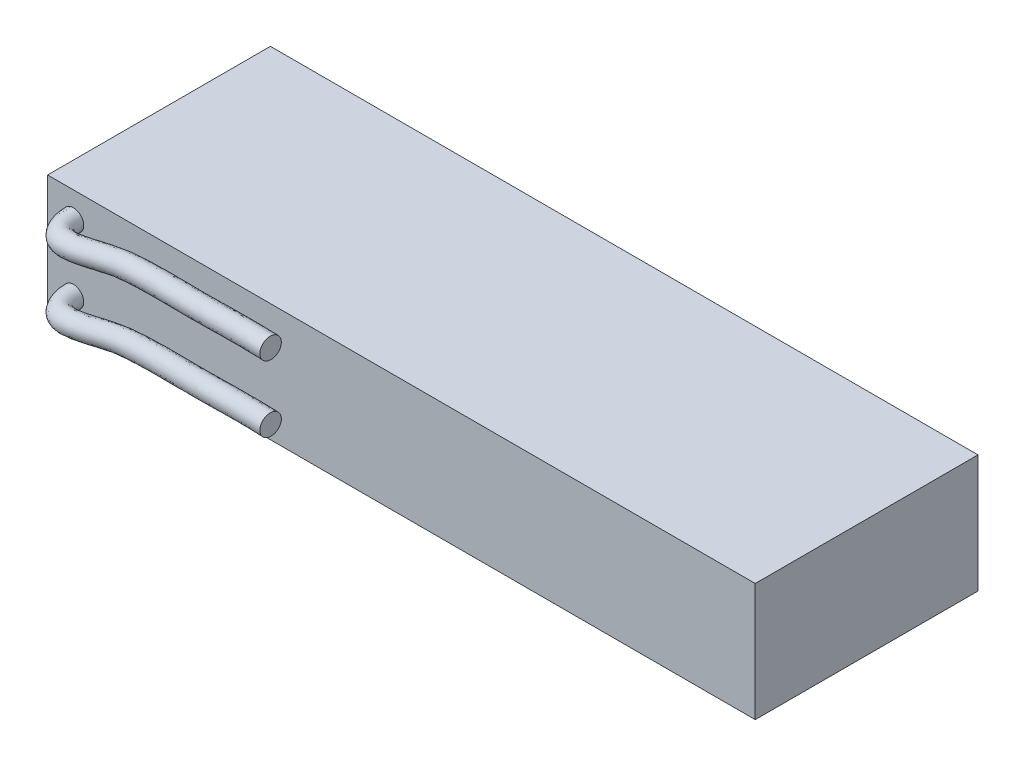
ISO-10303-21;
HEADER;
FILE_DESCRIPTION(('STEP AP214'),'2;1');
FILE_NAME('part.step','',(''),(''),'','','');
FILE_SCHEMA(('AUTOMOTIVE_DESIGN { 1 0 10303 214 1 1 1 1 }'));
ENDSEC;
DATA;
#1=APPLICATION_CONTEXT('core data for automotive mechanical design processes');
#2=APPLICATION_PROTOCOL_DEFINITION('international standard','automotive_design',2000,#1);
#3=PRODUCT_CONTEXT('',#1,'mechanical');
#4=PRODUCT('Part','Part','',(#3));
#5=PRODUCT_RELATED_PRODUCT_CATEGORY('part','',(#4));
#6=PRODUCT_DEFINITION_FORMATION('','',#4);
#7=PRODUCT_DEFINITION_CONTEXT('part definition',#1,'design');
#8=PRODUCT_DEFINITION('design','',#6,#7);
#9=PRODUCT_DEFINITION_SHAPE('','',#8);
#10=(LENGTH_UNIT() NAMED_UNIT(*) SI_UNIT(.MILLI.,.METRE.));
#11=(NAMED_UNIT(*) PLANE_ANGLE_UNIT() SI_UNIT($,.RADIAN.));
#12=(NAMED_UNIT(*) SI_UNIT($,.STERADIAN.) SOLID_ANGLE_UNIT());
#13=UNCERTAINTY_MEASURE_WITH_UNIT(LENGTH_MEASURE(1.E-05),#10,'distance_accuracy_value','');
#14=(GEOMETRIC_REPRESENTATION_CONTEXT(3) GLOBAL_UNCERTAINTY_ASSIGNED_CONTEXT((#13)) GLOBAL_UNIT_ASSIGNED_CONTEXT((#10,
#11,#12)) REPRESENTATION_CONTEXT('',''));
#15=CARTESIAN_POINT('',(0.,0.,0.));
#16=DIRECTION('',(0.,0.,1.));
#17=DIRECTION('',(1.,0.,0.));
#18=AXIS2_PLACEMENT_3D('',#15,#16,#17);
#19=CARTESIAN_POINT('',(0.,22.86,0.));
#20=DIRECTION('',(1.,0.,0.));
#21=DIRECTION('',(0.,0.,-1.));
#22=AXIS2_PLACEMENT_3D('',#19,#20,#21);
#23=PLANE('',#22);
#24=DIRECTION('',(0.,0.,1.));
#25=VECTOR('',#24,1.);
#26=CARTESIAN_POINT('',(0.,0.,0.));
#27=LINE('',#26,#25);
#28=CARTESIAN_POINT('',(0.,0.,-43.18));
#29=VERTEX_POINT('',#28);
#30=CARTESIAN_POINT('',(0.,0.,0.));
#31=VERTEX_POINT('',#30);
#32=EDGE_CURVE('E102',#29,#31,#27,.T.);
#33=ORIENTED_EDGE('',*,*,#32,.T.);
#34=DIRECTION('',(0.,-1.,0.));
#35=VECTOR('',#34,1.);
#36=CARTESIAN_POINT('',(0.,22.86,0.));
#37=LINE('',#36,#35);
#38=CARTESIAN_POINT('',(0.,22.86,0.));
#39=VERTEX_POINT('',#38);
#40=EDGE_CURVE('E11',#39,#31,#37,.T.);
#41=ORIENTED_EDGE('',*,*,#40,.F.);
#42=DIRECTION('',(0.,0.,1.));
#43=VECTOR('',#42,1.);
#44=CARTESIAN_POINT('',(0.,22.86,0.));
#45=LINE('',#44,#43);
#46=CARTESIAN_POINT('',(0.,22.86,-43.18));
#47=VERTEX_POINT('',#46);
#48=EDGE_CURVE('E103',#47,#39,#45,.T.);
#49=ORIENTED_EDGE('',*,*,#48,.F.);
#50=DIRECTION('',(0.,-1.,0.));
#51=VECTOR('',#50,1.);
#52=CARTESIAN_POINT('',(0.,22.86,-43.18));
#53=LINE('',#52,#51);
#54=EDGE_CURVE('E109',#47,#29,#53,.T.);
#55=ORIENTED_EDGE('',*,*,#54,.T.);
#56=EDGE_LOOP('',(#33,#41,#49,#55));
#57=FACE_BOUND('',#56,.T.);
#58=ADVANCED_FACE('F34',(#57),#23,.F.);
#59=CARTESIAN_POINT('',(0.,22.86,0.));
#60=DIRECTION('',(0.,0.,-1.));
#61=DIRECTION('',(-1.,0.,0.));
#62=AXIS2_PLACEMENT_3D('',#59,#60,#61);
#63=PLANE('',#62);
#64=CARTESIAN_POINT('',(5.,5.,0.));
#65=DIRECTION('',(0.,0.,1.));
#66=DIRECTION('',(1.,0.,0.));
#67=AXIS2_PLACEMENT_3D('',#64,#65,#66);
#68=CIRCLE('',#67,2.);
#69=CARTESIAN_POINT('',(7.,5.,0.));
#70=VERTEX_POINT('',#69);
#71=EDGE_CURVE('E93',#70,#70,#68,.T.);
#72=ORIENTED_EDGE('',*,*,#71,.F.);
#73=EDGE_LOOP('',(#72));
#74=FACE_BOUND('',#73,.T.);
#75=CARTESIAN_POINT('',(5.,17.86,0.));
#76=DIRECTION('',(0.,0.,1.));
#77=DIRECTION('',(-1.,0.,0.));
#78=AXIS2_PLACEMENT_3D('',#75,#76,#77);
#79=CIRCLE('',#78,2.);
#80=CARTESIAN_POINT('',(3.,17.86,0.));
#81=VERTEX_POINT('',#80);
#82=EDGE_CURVE('E92',#81,#81,#79,.T.);
#83=ORIENTED_EDGE('',*,*,#82,.F.);
#84=EDGE_LOOP('',(#83));
#85=FACE_BOUND('',#84,.T.);
#86=DIRECTION('',(1.,0.,0.));
#87=VECTOR('',#86,1.);
#88=CARTESIAN_POINT('',(0.,0.,0.));
#89=LINE('',#88,#87);
#90=CARTESIAN_POINT('',(137.16,0.,0.));
#91=VERTEX_POINT('',#90);
#92=EDGE_CURVE('E112',#31,#91,#89,.T.);
#93=ORIENTED_EDGE('',*,*,#92,.T.);
#94=DIRECTION('',(0.,-1.,0.));
#95=VECTOR('',#94,1.);
#96=CARTESIAN_POINT('',(137.16,22.86,0.));
#97=LINE('',#96,#95);
#98=CARTESIAN_POINT('',(137.16,22.86,0.));
#99=VERTEX_POINT('',#98);
#100=EDGE_CURVE('E42',#99,#91,#97,.T.);
#101=ORIENTED_EDGE('',*,*,#100,.F.);
#102=DIRECTION('',(1.,0.,0.));
#103=VECTOR('',#102,1.);
#104=CARTESIAN_POINT('',(0.,22.86,0.));
#105=LINE('',#104,#103);
#106=EDGE_CURVE('E81',#39,#99,#105,.T.);
#107=ORIENTED_EDGE('',*,*,#106,.F.);
#108=ORIENTED_EDGE('',*,*,#40,.T.);
#109=EDGE_LOOP('',(#93,#101,#107,#108));
#110=FACE_BOUND('',#109,.T.);
#111=ADVANCED_FACE('F135',(#74,#85,#110),#63,.F.);
#112=CARTESIAN_POINT('',(137.16,22.86,0.));
#113=DIRECTION('',(-1.,0.,0.));
#114=DIRECTION('',(0.,0.,1.));
#115=AXIS2_PLACEMENT_3D('',#112,#113,#114);
#116=PLANE('',#115);
#117=DIRECTION('',(0.,0.,-1.));
#118=VECTOR('',#117,1.);
#119=CARTESIAN_POINT('',(137.16,0.,0.));
#120=LINE('',#119,#118);
#121=CARTESIAN_POINT('',(137.16,0.,-43.18));
#122=VERTEX_POINT('',#121);
#123=EDGE_CURVE('E68',#91,#122,#120,.T.);
#124=ORIENTED_EDGE('',*,*,#123,.T.);
#125=DIRECTION('',(0.,-1.,0.));
#126=VECTOR('',#125,1.);
#127=CARTESIAN_POINT('',(137.16,22.86,-43.18));
#128=LINE('',#127,#126);
#129=CARTESIAN_POINT('',(137.16,22.86,-43.18));
#130=VERTEX_POINT('',#129);
#131=EDGE_CURVE('E117',#130,#122,#128,.T.);
#132=ORIENTED_EDGE('',*,*,#131,.F.);
#133=DIRECTION('',(0.,0.,-1.));
#134=VECTOR('',#133,1.);
#135=CARTESIAN_POINT('',(137.16,22.86,0.));
#136=LINE('',#135,#134);
#137=EDGE_CURVE('E106',#99,#130,#136,.T.);
#138=ORIENTED_EDGE('',*,*,#137,.F.);
#139=ORIENTED_EDGE('',*,*,#100,.T.);
#140=EDGE_LOOP('',(#124,#132,#138,#139));
#141=FACE_BOUND('',#140,.T.);
#142=ADVANCED_FACE('F119',(#141),#116,.F.);
#143=CARTESIAN_POINT('',(0.,22.86,-43.18));
#144=DIRECTION('',(0.,0.,1.));
#145=DIRECTION('',(1.,0.,0.));
#146=AXIS2_PLACEMENT_3D('',#143,#144,#145);
#147=PLANE('',#146);
#148=DIRECTION('',(-1.,0.,0.));
#149=VECTOR('',#148,1.);
#150=CARTESIAN_POINT('',(0.,0.,-43.18));
#151=LINE('',#150,#149);
#152=EDGE_CURVE('E74',#122,#29,#151,.T.);
#153=ORIENTED_EDGE('',*,*,#152,.T.);
#154=ORIENTED_EDGE('',*,*,#54,.F.);
#155=DIRECTION('',(-1.,0.,0.));
#156=VECTOR('',#155,1.);
#157=CARTESIAN_POINT('',(0.,22.86,-43.18));
#158=LINE('',#157,#156);
#159=EDGE_CURVE('E50',#130,#47,#158,.T.);
#160=ORIENTED_EDGE('',*,*,#159,.F.);
#161=ORIENTED_EDGE('',*,*,#131,.T.);
#162=EDGE_LOOP('',(#153,#154,#160,#161));
#163=FACE_BOUND('',#162,.T.);
#164=ADVANCED_FACE('F126',(#163),#147,.F.);
#165=CARTESIAN_POINT('',(0.,22.86,0.));
#166=DIRECTION('',(0.,-1.,0.));
#167=DIRECTION('',(0.,0.,-1.));
#168=AXIS2_PLACEMENT_3D('',#165,#166,#167);
#169=PLANE('',#168);
#170=ORIENTED_EDGE('',*,*,#48,.T.);
#171=ORIENTED_EDGE('',*,*,#106,.T.);
#172=ORIENTED_EDGE('',*,*,#137,.T.);
#173=ORIENTED_EDGE('',*,*,#159,.T.);
#174=EDGE_LOOP('',(#170,#171,#172,#173));
#175=FACE_BOUND('',#174,.T.);
#176=ADVANCED_FACE('F128',(#175),#169,.F.);
#177=CARTESIAN_POINT('',(0.,0.,0.));
#178=DIRECTION('',(0.,-1.,0.));
#179=DIRECTION('',(0.,0.,-1.));
#180=AXIS2_PLACEMENT_3D('',#177,#178,#179);
#181=PLANE('',#180);
#182=ORIENTED_EDGE('',*,*,#32,.F.);
#183=ORIENTED_EDGE('',*,*,#152,.F.);
#184=ORIENTED_EDGE('',*,*,#123,.F.);
#185=ORIENTED_EDGE('',*,*,#92,.F.);
#186=EDGE_LOOP('',(#182,#183,#184,#185));
#187=FACE_BOUND('',#186,.T.);
#188=ADVANCED_FACE('F122',(#187),#181,.T.);
#189=CARTESIAN_POINT('',(45.6447839927529,17.86,2.42594298798189));
#190=DIRECTION('',(-0.999051723843521,0.,-0.0435390983518147));
#191=DIRECTION('',(-0.0435390983518147,0.,0.999051723843521));
#192=AXIS2_PLACEMENT_3D('',#189,#190,#191);
#193=PLANE('',#192);
#194=CARTESIAN_POINT('',(45.6447839927529,17.86,2.42594298798189));
#195=DIRECTION('',(0.999051723843521,0.,0.0435390983518147));
#196=DIRECTION('',(-0.0435390983518147,0.,0.999051723843521));
#197=AXIS2_PLACEMENT_3D('',#194,#195,#196);
#198=CIRCLE('',#197,2.);
#199=CARTESIAN_POINT('',(45.5577057960492,17.86,4.42404643566893));
#200=VERTEX_POINT('',#199);
#201=EDGE_CURVE('E96',#200,#200,#198,.T.);
#202=ORIENTED_EDGE('',*,*,#201,.T.);
#203=EDGE_LOOP('',(#202));
#204=FACE_BOUND('',#203,.T.);
#205=ADVANCED_FACE('F151',(#204),#193,.F.);
#206=CARTESIAN_POINT('',(3.,17.86,0.));
#207=CARTESIAN_POINT('',(3.00000000021655,17.86,1.18649312177214));
#208=CARTESIAN_POINT('',(3.22117800068778,17.86,2.44722540596611));
#209=CARTESIAN_POINT('',(4.08867271613356,17.86,4.23520551632342));
#210=CARTESIAN_POINT('',(4.47367152749843,17.86,4.8154985073478));
#211=CARTESIAN_POINT('',(5.51558677971765,17.86,5.82687663716884));
#212=CARTESIAN_POINT('',(6.18245885322934,17.86,6.252048382623));
#213=CARTESIAN_POINT('',(7.88045837199142,17.86,6.77423105606483));
#214=CARTESIAN_POINT('',(8.78021563221628,17.86,6.7637343109011));
#215=CARTESIAN_POINT('',(10.5097736665656,17.86,6.5634326780057));
#216=CARTESIAN_POINT('',(11.3564293598732,17.86,6.36127084035195));
#217=CARTESIAN_POINT('',(13.8805658934167,17.86,5.67126036178111));
#218=CARTESIAN_POINT('',(15.5610963270309,17.86,5.09595805219165));
#219=CARTESIAN_POINT('',(17.7869352393191,17.86,4.66080338325675));
#220=CARTESIAN_POINT('',(18.6245477655208,17.86,4.58387270592686));
#221=CARTESIAN_POINT('',(23.8943683977501,17.86,4.21358938981813));
#222=CARTESIAN_POINT('',(27.2880633144873,17.86,4.41746407990182));
#223=CARTESIAN_POINT('',(32.6928478844195,17.86,4.40051424456018));
#224=CARTESIAN_POINT('',(33.774010402894,17.86,4.38447830172204));
#225=CARTESIAN_POINT('',(39.0399110831786,17.86,4.30537188490984));
#226=CARTESIAN_POINT('',(41.7808397452326,17.86,4.2594490098748));
#227=CARTESIAN_POINT('',(45.5577057960492,17.86,4.42404643566893));
#228=CARTESIAN_POINT('',(3.,13.86,0.));
#229=CARTESIAN_POINT('',(3.00000000021655,13.86,1.18649312177214));
#230=CARTESIAN_POINT('',(3.22117800068778,13.86,2.44722540596611));
#231=CARTESIAN_POINT('',(4.08867271613356,13.86,4.23520551632342));
#232=CARTESIAN_POINT('',(4.47367152749843,13.86,4.8154985073478));
#233=CARTESIAN_POINT('',(5.51558677971765,13.86,5.82687663716884));
#234=CARTESIAN_POINT('',(6.18245885322863,13.8600000000002,6.2520483826228));
#235=CARTESIAN_POINT('',(7.88045837199228,13.8599999999998,6.77423105606508));
#236=CARTESIAN_POINT('',(8.78021563221628,13.86,6.7637343109011));
#237=CARTESIAN_POINT('',(10.5097736665656,13.86,6.5634326780057));
#238=CARTESIAN_POINT('',(11.3564293598732,13.86,6.36127084035195));
#239=CARTESIAN_POINT('',(13.8805658934167,13.86,5.67126036178111));
#240=CARTESIAN_POINT('',(15.5610963270309,13.86,5.09595805219165));
#241=CARTESIAN_POINT('',(17.7869352393191,13.86,4.66080338325675));
#242=CARTESIAN_POINT('',(18.6245477655201,13.86,4.58387270592686));
#243=CARTESIAN_POINT('',(23.894368397754,13.86,4.21358938981813));
#244=CARTESIAN_POINT('',(27.2880633144873,13.86,4.41746407990182));
#245=CARTESIAN_POINT('',(32.6928478844195,13.86,4.40051424456018));
#246=CARTESIAN_POINT('',(33.774010402894,13.86,4.38447830172204));
#247=CARTESIAN_POINT('',(39.0399110831786,13.86,4.30537188490984));
#248=CARTESIAN_POINT('',(41.7808397452326,13.86,4.2594490098748));
#249=CARTESIAN_POINT('',(45.5577057960492,13.86,4.42404643566893));
#250=CARTESIAN_POINT('',(7.,13.86,0.));
#251=CARTESIAN_POINT('',(6.99999999342715,13.86,0.637548198642906));
#252=CARTESIAN_POINT('',(7.15430884220732,13.86,1.39027447595694));
#253=CARTESIAN_POINT('',(7.52028625485354,13.86,2.14458496906916));
#254=CARTESIAN_POINT('',(7.65815179070385,13.86,2.33207267160076));
#255=CARTESIAN_POINT('',(7.90321445840092,13.86,2.569952911788));
#256=CARTESIAN_POINT('',(8.00045595182172,13.8600000000002,2.62625890024512));
#257=CARTESIAN_POINT('',(8.27842367566667,13.8599999999998,2.71174177140157));
#258=CARTESIAN_POINT('',(8.65098737458355,13.86,2.75196538127614));
#259=CARTESIAN_POINT('',(9.71866611740037,13.86,2.6283165573279));
#260=CARTESIAN_POINT('',(10.3969262674189,13.86,2.47680103410425));
#261=CARTESIAN_POINT('',(12.6352933479539,13.86,1.86490990808291));
#262=CARTESIAN_POINT('',(14.380106833186,13.86,1.25111834456908));
#263=CARTESIAN_POINT('',(17.2747352670483,13.86,0.685214376831135));
#264=CARTESIAN_POINT('',(18.2927600995036,13.86,0.597323577738601));
#265=CARTESIAN_POINT('',(23.8772799906294,13.86,0.20492795444599));
#266=CARTESIAN_POINT('',(27.4114148513801,13.86,0.417057569746131));
#267=CARTESIAN_POINT('',(32.6478162376825,13.86,0.400635797440755));
#268=CARTESIAN_POINT('',(33.7146199523293,13.86,0.384919169290372));
#269=CARTESIAN_POINT('',(38.9768553561903,13.86,0.30586781369428));
#270=CARTESIAN_POINT('',(41.8379020981233,13.86,0.258139106439266));
#271=CARTESIAN_POINT('',(45.7318621894565,13.86,0.427839540294846));
#272=CARTESIAN_POINT('',(7.,17.86,0.));
#273=CARTESIAN_POINT('',(6.99999999342715,17.86,0.637548198642905));
#274=CARTESIAN_POINT('',(7.15430884220732,17.86,1.39027447595704));
#275=CARTESIAN_POINT('',(7.52028625485354,17.86,2.14458496906911));
#276=CARTESIAN_POINT('',(7.65815179070385,17.86,2.33207267160076));
#277=CARTESIAN_POINT('',(7.90321445840092,17.86,2.569952911788));
#278=CARTESIAN_POINT('',(8.00045595182254,17.86,2.62625890024542));
#279=CARTESIAN_POINT('',(8.27842367566569,17.86,2.7117417714012));
#280=CARTESIAN_POINT('',(8.65098737458325,17.86,2.75196538127613));
#281=CARTESIAN_POINT('',(9.71866611740068,17.86,2.6283165573279));
#282=CARTESIAN_POINT('',(10.3969262674189,17.86,2.47680103410425));
#283=CARTESIAN_POINT('',(12.6352933479539,17.86,1.86490990808291));
#284=CARTESIAN_POINT('',(14.3801068331846,17.86,1.25111834456908));
#285=CARTESIAN_POINT('',(17.2747352670491,17.86,0.685214376831134));
#286=CARTESIAN_POINT('',(18.2927600995044,17.86,0.597323577738601));
#287=CARTESIAN_POINT('',(23.8772799906255,17.86,0.204927954445989));
#288=CARTESIAN_POINT('',(27.4114148513801,17.86,0.417057569746131));
#289=CARTESIAN_POINT('',(32.6478162376825,17.86,0.400635797440754));
#290=CARTESIAN_POINT('',(33.7146199523293,17.86,0.384919169290371));
#291=CARTESIAN_POINT('',(38.9768553561903,17.86,0.305867813694279));
#292=CARTESIAN_POINT('',(41.8379020981233,17.86,0.258139106439265));
#293=CARTESIAN_POINT('',(45.7318621894565,17.86,0.427839540294845));
#294=CARTESIAN_POINT('',(7.00000000000001,21.86,0.));
#295=CARTESIAN_POINT('',(6.99999999342716,21.86,0.637548198642905));
#296=CARTESIAN_POINT('',(7.15430884220733,21.86,1.39027447595714));
#297=CARTESIAN_POINT('',(7.52028625485354,21.86,2.14458496906906));
#298=CARTESIAN_POINT('',(7.65815179070385,21.86,2.33207267160076));
#299=CARTESIAN_POINT('',(7.90321445840092,21.86,2.56995291178799));
#300=CARTESIAN_POINT('',(8.00045595182335,21.8599999999998,2.62625890024573));
#301=CARTESIAN_POINT('',(8.27842367566471,21.8600000000002,2.71174177140083));
#302=CARTESIAN_POINT('',(8.65098737458294,21.86,2.75196538127613));
#303=CARTESIAN_POINT('',(9.71866611740098,21.86,2.6283165573279));
#304=CARTESIAN_POINT('',(10.3969262674189,21.86,2.47680103410425));
#305=CARTESIAN_POINT('',(12.6352933479539,21.86,1.8649099080829));
#306=CARTESIAN_POINT('',(14.3801068331832,21.86,1.25111834456908));
#307=CARTESIAN_POINT('',(17.27473526705,21.86,0.685214376831132));
#308=CARTESIAN_POINT('',(18.2927600995051,21.86,0.597323577738599));
#309=CARTESIAN_POINT('',(23.8772799906215,21.86,0.204927954445987));
#310=CARTESIAN_POINT('',(27.4114148513801,21.86,0.417057569746129));
#311=CARTESIAN_POINT('',(32.6478162376825,21.86,0.400635797440752));
#312=CARTESIAN_POINT('',(33.7146199523293,21.86,0.38491916929037));
#313=CARTESIAN_POINT('',(38.9768553561903,21.86,0.305867813694277));
#314=CARTESIAN_POINT('',(41.8379020981233,21.86,0.258139106439263));
#315=CARTESIAN_POINT('',(45.7318621894565,21.86,0.427839540294844));
#316=CARTESIAN_POINT('',(3.,21.86,0.));
#317=CARTESIAN_POINT('',(3.00000000021655,21.86,1.18649312177214));
#318=CARTESIAN_POINT('',(3.22117800068778,21.86,2.44722540596611));
#319=CARTESIAN_POINT('',(4.08867271613356,21.86,4.23520551632342));
#320=CARTESIAN_POINT('',(4.47367152749843,21.86,4.8154985073478));
#321=CARTESIAN_POINT('',(5.51558677971765,21.86,5.82687663716884));
#322=CARTESIAN_POINT('',(6.18245885323005,21.8599999999998,6.25204838262321));
#323=CARTESIAN_POINT('',(7.88045837199056,21.8600000000002,6.77423105606459));
#324=CARTESIAN_POINT('',(8.78021563221628,21.86,6.7637343109011));
#325=CARTESIAN_POINT('',(10.5097736665656,21.86,6.5634326780057));
#326=CARTESIAN_POINT('',(11.3564293598732,21.86,6.36127084035195));
#327=CARTESIAN_POINT('',(13.8805658934167,21.86,5.67126036178111));
#328=CARTESIAN_POINT('',(15.5610963270309,21.86,5.09595805219165));
#329=CARTESIAN_POINT('',(17.7869352393191,21.86,4.66080338325675));
#330=CARTESIAN_POINT('',(18.6245477655216,21.86,4.58387270592686));
#331=CARTESIAN_POINT('',(23.8943683977461,21.86,4.21358938981813));
#332=CARTESIAN_POINT('',(27.2880633144873,21.86,4.41746407990182));
#333=CARTESIAN_POINT('',(32.6928478844195,21.86,4.40051424456018));
#334=CARTESIAN_POINT('',(33.774010402894,21.86,4.38447830172204));
#335=CARTESIAN_POINT('',(39.0399110831786,21.86,4.30537188490984));
#336=CARTESIAN_POINT('',(41.7808397452326,21.86,4.2594490098748));
#337=CARTESIAN_POINT('',(45.5577057960492,21.86,4.42404643566893));
#338=CARTESIAN_POINT('',(3.,17.86,0.));
#339=CARTESIAN_POINT('',(3.00000000021655,17.86,1.18649312177214));
#340=CARTESIAN_POINT('',(3.22117800068778,17.86,2.44722540596611));
#341=CARTESIAN_POINT('',(4.08867271613356,17.86,4.23520551632342));
#342=CARTESIAN_POINT('',(4.47367152749843,17.86,4.8154985073478));
#343=CARTESIAN_POINT('',(5.51558677971765,17.86,5.82687663716884));
#344=CARTESIAN_POINT('',(6.18245885322934,17.86,6.252048382623));
#345=CARTESIAN_POINT('',(7.88045837199142,17.86,6.77423105606483));
#346=CARTESIAN_POINT('',(8.78021563221628,17.86,6.7637343109011));
#347=CARTESIAN_POINT('',(10.5097736665656,17.86,6.5634326780057));
#348=CARTESIAN_POINT('',(11.3564293598732,17.86,6.36127084035195));
#349=CARTESIAN_POINT('',(13.8805658934167,17.86,5.67126036178111));
#350=CARTESIAN_POINT('',(15.5610963270309,17.86,5.09595805219165));
#351=CARTESIAN_POINT('',(17.7869352393191,17.86,4.66080338325675));
#352=CARTESIAN_POINT('',(18.6245477655208,17.86,4.58387270592686));
#353=CARTESIAN_POINT('',(23.8943683977501,17.86,4.21358938981813));
#354=CARTESIAN_POINT('',(27.2880633144873,17.86,4.41746407990182));
#355=CARTESIAN_POINT('',(32.6928478844195,17.86,4.40051424456018));
#356=CARTESIAN_POINT('',(33.774010402894,17.86,4.38447830172204));
#357=CARTESIAN_POINT('',(39.0399110831786,17.86,4.30537188490984));
#358=CARTESIAN_POINT('',(41.7808397452326,17.86,4.2594490098748));
#359=CARTESIAN_POINT('',(45.5577057960492,17.86,4.42404643566893));
#360=(BOUNDED_SURFACE() B_SPLINE_SURFACE(3,3,((#206,#207,#208,#209,#210,#211,#212,#213,#214,
#215,#216,#217,#218,#219,#220,#221,#222,#223,#224,#225,#226,#227),(#228,#229,#230,#231,#232,
#233,#234,#235,#236,#237,#238,#239,#240,#241,#242,#243,#244,#245,#246,#247,#248,#249),(#250,
#251,#252,#253,#254,#255,#256,#257,#258,#259,#260,#261,#262,#263,#264,#265,#266,#267,#268,#269,
#270,#271),(#272,#273,#274,#275,#276,#277,#278,#279,#280,#281,#282,#283,#284,#285,#286,#287,
#288,#289,#290,#291,#292,#293),(#294,#295,#296,#297,#298,#299,#300,#301,#302,#303,#304,#305,
#306,#307,#308,#309,#310,#311,#312,#313,#314,#315),(#316,#317,#318,#319,#320,#321,#322,#323,
#324,#325,#326,#327,#328,#329,#330,#331,#332,#333,#334,#335,#336,#337),(#338,#339,#340,#341,
#342,#343,#344,#345,#346,#347,#348,#349,#350,#351,#352,#353,#354,#355,#356,#357,#358,#359)),
.UNSPECIFIED.,.T.,.F.,.F.) B_SPLINE_SURFACE_WITH_KNOTS((4,3,4),(4,2,2,2,2,2,2,2,2,2,4),(0.,0.5,
1.),(0.,0.072238327814479,0.108357491721718,0.144476655628958,0.188220772842459,
0.23196489005596,0.319453124482961,0.373462750260431,0.650005117498784,0.716115622063216,1.),
.UNSPECIFIED.) GEOMETRIC_REPRESENTATION_ITEM() RATIONAL_B_SPLINE_SURFACE(((1.,1.,1.,1.,1.,1.,1.,
1.,1.,1.,1.,1.,1.,1.,1.,1.,1.,1.,1.,1.,1.,1.),(0.333333333333333,0.333333333333333,
0.333333333333333,0.333333333333333,0.333333333333333,0.333333333333333,0.333333333333333,
0.333333333333333,0.333333333333333,0.333333333333333,0.333333333333333,0.333333333333333,
0.333333333333333,0.333333333333333,0.333333333333333,0.333333333333333,0.333333333333333,
0.333333333333333,0.333333333333333,0.333333333333333,0.333333333333333,0.333333333333333),
(0.333333333333333,0.333333333333333,0.333333333333333,0.333333333333333,0.333333333333333,
0.333333333333333,0.333333333333333,0.333333333333333,0.333333333333333,0.333333333333333,
0.333333333333333,0.333333333333333,0.333333333333333,0.333333333333333,0.333333333333333,
0.333333333333333,0.333333333333333,0.333333333333333,0.333333333333333,0.333333333333333,
0.333333333333333,0.333333333333333),(1.,1.,1.,1.,1.,1.,1.,1.,1.,1.,1.,1.,1.,1.,1.,1.,1.,1.,1.,
1.,1.,1.),(0.333333333333333,0.333333333333333,0.333333333333333,0.333333333333333,
0.333333333333333,0.333333333333333,0.333333333333333,0.333333333333333,0.333333333333333,
0.333333333333333,0.333333333333333,0.333333333333333,0.333333333333333,0.333333333333333,
0.333333333333333,0.333333333333333,0.333333333333333,0.333333333333333,0.333333333333333,
0.333333333333333,0.333333333333333,0.333333333333333),(0.333333333333333,0.333333333333333,
0.333333333333333,0.333333333333333,0.333333333333333,0.333333333333333,0.333333333333333,
0.333333333333333,0.333333333333333,0.333333333333333,0.333333333333333,0.333333333333333,
0.333333333333333,0.333333333333333,0.333333333333333,0.333333333333333,0.333333333333333,
0.333333333333333,0.333333333333333,0.333333333333333,0.333333333333333,0.333333333333333),(1.,
1.,1.,1.,1.,1.,1.,1.,1.,1.,1.,1.,1.,1.,1.,1.,1.,1.,1.,1.,1.,1.))) REPRESENTATION_ITEM('') SURFACE());
#361=ORIENTED_EDGE('',*,*,#201,.F.);
#362=EDGE_LOOP('',(#361));
#363=FACE_BOUND('',#362,.T.);
#364=ORIENTED_EDGE('',*,*,#82,.T.);
#365=EDGE_LOOP('',(#364));
#366=FACE_BOUND('',#365,.T.);
#367=ADVANCED_FACE('F149',(#363,#366),#360,.T.);
#368=CARTESIAN_POINT('',(45.6447839927529,5.,2.42594298798189));
#369=DIRECTION('',(0.999051723843521,0.,0.0435390983518147));
#370=DIRECTION('',(0.0435390983518147,0.,-0.999051723843521));
#371=AXIS2_PLACEMENT_3D('',#368,#369,#370);
#372=PLANE('',#371);
#373=CARTESIAN_POINT('',(45.6447839927529,5.,2.42594298798189));
#374=DIRECTION('',(0.999051723843521,0.,0.0435390983518147));
#375=DIRECTION('',(0.0435390983518147,0.,-0.999051723843521));
#376=AXIS2_PLACEMENT_3D('',#373,#374,#375);
#377=CIRCLE('',#376,2.);
#378=CARTESIAN_POINT('',(45.7318621894565,5.,0.427839540294846));
#379=VERTEX_POINT('',#378);
#380=EDGE_CURVE('E89',#379,#379,#377,.T.);
#381=ORIENTED_EDGE('',*,*,#380,.T.);
#382=EDGE_LOOP('',(#381));
#383=FACE_BOUND('',#382,.T.);
#384=ADVANCED_FACE('F90',(#383),#372,.T.);
#385=CARTESIAN_POINT('',(7.,5.,0.));
#386=CARTESIAN_POINT('',(6.99999999342715,5.,0.637548198642906));
#387=CARTESIAN_POINT('',(7.15430884220732,5.,1.39027447595704));
#388=CARTESIAN_POINT('',(7.52028625485354,5.,2.14458496906911));
#389=CARTESIAN_POINT('',(7.65815179070385,5.,2.33207267160076));
#390=CARTESIAN_POINT('',(7.90321445840092,5.,2.569952911788));
#391=CARTESIAN_POINT('',(8.0004559518201,5.0000000000002,2.62625890024441));
#392=CARTESIAN_POINT('',(8.27842367566864,4.99999999999976,2.71174177140242));
#393=CARTESIAN_POINT('',(8.65098737458325,5.,2.75196538127614));
#394=CARTESIAN_POINT('',(9.71866611740068,5.,2.6283165573279));
#395=CARTESIAN_POINT('',(10.3969262674189,5.,2.47680103410425));
#396=CARTESIAN_POINT('',(12.6352933479539,5.,1.86490990808291));
#397=CARTESIAN_POINT('',(14.3801068331874,5.,1.25111834456908));
#398=CARTESIAN_POINT('',(17.2747352670474,5.,0.685214376831135));
#399=CARTESIAN_POINT('',(18.2927600995028,5.,0.597323577738601));
#400=CARTESIAN_POINT('',(23.8772799906334,5.,0.20492795444599));
#401=CARTESIAN_POINT('',(27.4114148513801,5.,0.417057569746131));
#402=CARTESIAN_POINT('',(32.6478162376825,5.,0.400635797440755));
#403=CARTESIAN_POINT('',(33.7146199523293,5.,0.384919169290372));
#404=CARTESIAN_POINT('',(38.9768553561903,5.,0.30586781369428));
#405=CARTESIAN_POINT('',(41.8379020981233,5.,0.258139106439266));
#406=CARTESIAN_POINT('',(45.7318621894565,5.,0.427839540294846));
#407=CARTESIAN_POINT('',(7.,9.,0.));
#408=CARTESIAN_POINT('',(6.99999999342715,9.,0.637548198642906));
#409=CARTESIAN_POINT('',(7.15430884220732,9.,1.39027447595704));
#410=CARTESIAN_POINT('',(7.52028625485354,9.,2.14458496906911));
#411=CARTESIAN_POINT('',(7.65815179070385,9.,2.33207267160076));
#412=CARTESIAN_POINT('',(7.90321445840092,9.,2.569952911788));
#413=CARTESIAN_POINT('',(8.00045595182071,9.0000000000001,2.62625890024461));
#414=CARTESIAN_POINT('',(8.2784236756679,8.99999999999988,2.71174177140218));
#415=CARTESIAN_POINT('',(8.65098737458325,9.,2.75196538127614));
#416=CARTESIAN_POINT('',(9.71866611740068,9.,2.6283165573279));
#417=CARTESIAN_POINT('',(10.3969262674189,9.,2.47680103410425));
#418=CARTESIAN_POINT('',(12.6352933479539,9.,1.86490990808291));
#419=CARTESIAN_POINT('',(14.3801068331874,9.,1.25111834456908));
#420=CARTESIAN_POINT('',(17.2747352670474,9.,0.685214376831135));
#421=CARTESIAN_POINT('',(18.2927600995028,9.,0.597323577738601));
#422=CARTESIAN_POINT('',(23.8772799906334,9.,0.20492795444599));
#423=CARTESIAN_POINT('',(27.4114148513801,9.,0.417057569746131));
#424=CARTESIAN_POINT('',(32.6478162376825,9.,0.400635797440755));
#425=CARTESIAN_POINT('',(33.7146199523293,9.,0.384919169290372));
#426=CARTESIAN_POINT('',(38.9768553561903,9.,0.30586781369428));
#427=CARTESIAN_POINT('',(41.8379020981233,9.,0.258139106439266));
#428=CARTESIAN_POINT('',(45.7318621894565,9.,0.427839540294846));
#429=CARTESIAN_POINT('',(3.,9.,0.));
#430=CARTESIAN_POINT('',(3.00000000021655,9.,1.18649312177214));
#431=CARTESIAN_POINT('',(3.22117800068747,9.,2.44722540596611));
#432=CARTESIAN_POINT('',(4.08867271613371,9.,4.23520551632342));
#433=CARTESIAN_POINT('',(4.47367152749843,9.,4.81549850734779));
#434=CARTESIAN_POINT('',(5.51558677971765,9.,5.82687663716883));
#435=CARTESIAN_POINT('',(6.18245885322792,9.0000000000001,6.2520483826229));
#436=CARTESIAN_POINT('',(7.88045837199314,8.99999999999988,6.77423105606496));
#437=CARTESIAN_POINT('',(8.78021563221627,9.,6.7637343109008));
#438=CARTESIAN_POINT('',(10.5097736665656,9.,6.563432678006));
#439=CARTESIAN_POINT('',(11.3564293598728,9.,6.36127084035195));
#440=CARTESIAN_POINT('',(13.8805658934174,9.,5.67126036178111));
#441=CARTESIAN_POINT('',(15.5610963270309,9.,5.095958052192));
#442=CARTESIAN_POINT('',(17.7869352393191,9.,4.66080338325653));
#443=CARTESIAN_POINT('',(18.6245477655193,9.,4.58387270592647));
#444=CARTESIAN_POINT('',(23.894368397758,9.,4.2135893898201));
#445=CARTESIAN_POINT('',(27.2880633144873,9.,4.41746407989903));
#446=CARTESIAN_POINT('',(32.6928478844195,9.,4.40051424456085));
#447=CARTESIAN_POINT('',(33.774010402894,9.,4.3844783017216));
#448=CARTESIAN_POINT('',(39.0399110831786,9.,4.30537188491169));
#449=CARTESIAN_POINT('',(41.7808397452326,9.,4.25944900986647));
#450=CARTESIAN_POINT('',(45.5577057960492,9.,4.42404643566893));
#451=CARTESIAN_POINT('',(3.,5.,0.));
#452=CARTESIAN_POINT('',(3.00000000021655,5.,1.18649312177214));
#453=CARTESIAN_POINT('',(3.22117800068757,5.,2.44722540596611));
#454=CARTESIAN_POINT('',(4.08867271613366,5.,4.23520551632342));
#455=CARTESIAN_POINT('',(4.47367152749843,5.,4.8154985073478));
#456=CARTESIAN_POINT('',(5.51558677971765,5.,5.82687663716884));
#457=CARTESIAN_POINT('',(6.18245885322711,5.0000000000002,6.2520483826226));
#458=CARTESIAN_POINT('',(7.88045837199412,4.99999999999976,6.77423105606532));
#459=CARTESIAN_POINT('',(8.78021563221628,5.,6.7637343109008));
#460=CARTESIAN_POINT('',(10.5097736665656,5.,6.563432678006));
#461=CARTESIAN_POINT('',(11.3564293598732,5.,6.36127084035195));
#462=CARTESIAN_POINT('',(13.8805658934167,5.,5.67126036178111));
#463=CARTESIAN_POINT('',(15.5610963270309,5.,5.09595805219165));
#464=CARTESIAN_POINT('',(17.7869352393191,5.,4.66080338325675));
#465=CARTESIAN_POINT('',(18.6245477655193,5.,4.58387270592647));
#466=CARTESIAN_POINT('',(23.894368397758,5.,4.21358938982011));
#467=CARTESIAN_POINT('',(27.2880633144873,5.,4.41746407989996));
#468=CARTESIAN_POINT('',(32.6928478844195,5.,4.40051424456063));
#469=CARTESIAN_POINT('',(33.774010402894,5.,4.3844783017216));
#470=CARTESIAN_POINT('',(39.0399110831786,5.,4.30537188491169));
#471=CARTESIAN_POINT('',(41.7808397452326,5.,4.2594490098698));
#472=CARTESIAN_POINT('',(45.5577057960492,5.,4.42404643566893));
#473=CARTESIAN_POINT('',(3.,1.,0.));
#474=CARTESIAN_POINT('',(3.00000000021655,1.,1.18649312177214));
#475=CARTESIAN_POINT('',(3.22117800068768,1.,2.44722540596611));
#476=CARTESIAN_POINT('',(4.08867271613361,1.,4.23520551632342));
#477=CARTESIAN_POINT('',(4.47367152749843,1.,4.8154985073478));
#478=CARTESIAN_POINT('',(5.51558677971765,1.,5.82687663716884));
#479=CARTESIAN_POINT('',(6.1824588532263,1.0000000000003,6.2520483826223));
#480=CARTESIAN_POINT('',(7.8804583719951,0.999999999999633,6.77423105606569));
#481=CARTESIAN_POINT('',(8.78021563221628,1.,6.7637343109008));
#482=CARTESIAN_POINT('',(10.5097736665656,1.,6.563432678006));
#483=CARTESIAN_POINT('',(11.3564293598735,1.,6.36127084035195));
#484=CARTESIAN_POINT('',(13.880565893416,1.,5.67126036178111));
#485=CARTESIAN_POINT('',(15.5610963270309,1.,5.0959580521913));
#486=CARTESIAN_POINT('',(17.7869352393191,1.,4.66080338325697));
#487=CARTESIAN_POINT('',(18.6245477655193,1.,4.58387270592647));
#488=CARTESIAN_POINT('',(23.894368397758,1.,4.21358938982011));
#489=CARTESIAN_POINT('',(27.2880633144873,1.,4.41746407990089));
#490=CARTESIAN_POINT('',(32.6928478844195,1.,4.40051424456041));
#491=CARTESIAN_POINT('',(33.774010402894,1.,4.3844783017216));
#492=CARTESIAN_POINT('',(39.0399110831786,1.,4.30537188491169));
#493=CARTESIAN_POINT('',(41.7808397452326,1.,4.25944900987313));
#494=CARTESIAN_POINT('',(45.5577057960492,1.,4.42404643566893));
#495=CARTESIAN_POINT('',(7.,1.,0.));
#496=CARTESIAN_POINT('',(6.99999999342715,1.,0.637548198642906));
#497=CARTESIAN_POINT('',(7.15430884220732,1.,1.39027447595704));
#498=CARTESIAN_POINT('',(7.52028625485354,1.,2.14458496906911));
#499=CARTESIAN_POINT('',(7.65815179070385,1.,2.33207267160076));
#500=CARTESIAN_POINT('',(7.90321445840092,1.,2.569952911788));
#501=CARTESIAN_POINT('',(8.00045595181949,1.0000000000003,2.62625890024421));
#502=CARTESIAN_POINT('',(8.27842367566937,0.999999999999633,2.71174177140267));
#503=CARTESIAN_POINT('',(8.65098737458325,1.,2.75196538127614));
#504=CARTESIAN_POINT('',(9.71866611740068,1.,2.6283165573279));
#505=CARTESIAN_POINT('',(10.3969262674189,1.,2.47680103410425));
#506=CARTESIAN_POINT('',(12.6352933479539,1.,1.86490990808291));
#507=CARTESIAN_POINT('',(14.3801068331874,1.,1.25111834456908));
#508=CARTESIAN_POINT('',(17.2747352670474,1.,0.685214376831135));
#509=CARTESIAN_POINT('',(18.2927600995028,1.,0.597323577738601));
#510=CARTESIAN_POINT('',(23.8772799906334,1.,0.20492795444599));
#511=CARTESIAN_POINT('',(27.4114148513801,1.,0.417057569746131));
#512=CARTESIAN_POINT('',(32.6478162376825,1.,0.400635797440755));
#513=CARTESIAN_POINT('',(33.7146199523293,1.,0.384919169290372));
#514=CARTESIAN_POINT('',(38.9768553561903,1.,0.30586781369428));
#515=CARTESIAN_POINT('',(41.8379020981233,1.,0.258139106439266));
#516=CARTESIAN_POINT('',(45.7318621894565,1.,0.427839540294846));
#517=CARTESIAN_POINT('',(7.,5.,0.));
#518=CARTESIAN_POINT('',(6.99999999342715,5.,0.637548198642906));
#519=CARTESIAN_POINT('',(7.15430884220732,5.,1.39027447595704));
#520=CARTESIAN_POINT('',(7.52028625485354,5.,2.14458496906911));
#521=CARTESIAN_POINT('',(7.65815179070385,5.,2.33207267160076));
#522=CARTESIAN_POINT('',(7.90321445840092,5.,2.569952911788));
#523=CARTESIAN_POINT('',(8.0004559518201,5.0000000000002,2.62625890024441));
#524=CARTESIAN_POINT('',(8.27842367566864,4.99999999999976,2.71174177140242));
#525=CARTESIAN_POINT('',(8.65098737458325,5.,2.75196538127614));
#526=CARTESIAN_POINT('',(9.71866611740068,5.,2.6283165573279));
#527=CARTESIAN_POINT('',(10.3969262674189,5.,2.47680103410425));
#528=CARTESIAN_POINT('',(12.6352933479539,5.,1.86490990808291));
#529=CARTESIAN_POINT('',(14.3801068331874,5.,1.25111834456908));
#530=CARTESIAN_POINT('',(17.2747352670474,5.,0.685214376831135));
#531=CARTESIAN_POINT('',(18.2927600995028,5.,0.597323577738601));
#532=CARTESIAN_POINT('',(23.8772799906334,5.,0.20492795444599));
#533=CARTESIAN_POINT('',(27.4114148513801,5.,0.417057569746131));
#534=CARTESIAN_POINT('',(32.6478162376825,5.,0.400635797440755));
#535=CARTESIAN_POINT('',(33.7146199523293,5.,0.384919169290372));
#536=CARTESIAN_POINT('',(38.9768553561903,5.,0.30586781369428));
#537=CARTESIAN_POINT('',(41.8379020981233,5.,0.258139106439266));
#538=CARTESIAN_POINT('',(45.7318621894565,5.,0.427839540294846));
#539=(BOUNDED_SURFACE() B_SPLINE_SURFACE(3,3,((#385,#386,#387,#388,#389,#390,#391,#392,#393,
#394,#395,#396,#397,#398,#399,#400,#401,#402,#403,#404,#405,#406),(#407,#408,#409,#410,#411,
#412,#413,#414,#415,#416,#417,#418,#419,#420,#421,#422,#423,#424,#425,#426,#427,#428),(#429,
#430,#431,#432,#433,#434,#435,#436,#437,#438,#439,#440,#441,#442,#443,#444,#445,#446,#447,#448,
#449,#450),(#451,#452,#453,#454,#455,#456,#457,#458,#459,#460,#461,#462,#463,#464,#465,#466,
#467,#468,#469,#470,#471,#472),(#473,#474,#475,#476,#477,#478,#479,#480,#481,#482,#483,#484,
#485,#486,#487,#488,#489,#490,#491,#492,#493,#494),(#495,#496,#497,#498,#499,#500,#501,#502,
#503,#504,#505,#506,#507,#508,#509,#510,#511,#512,#513,#514,#515,#516),(#517,#518,#519,#520,
#521,#522,#523,#524,#525,#526,#527,#528,#529,#530,#531,#532,#533,#534,#535,#536,#537,#538)),
.UNSPECIFIED.,.T.,.F.,.F.) B_SPLINE_SURFACE_WITH_KNOTS((4,3,4),(4,2,2,2,2,2,2,2,2,2,4),(0.,0.5,
1.),(0.,0.072238327814479,0.108357491721718,0.144476655628958,0.188220772842459,
0.23196489005596,0.319453124482961,0.373462750260431,0.650005117498784,0.716115622063216,1.),
.UNSPECIFIED.) GEOMETRIC_REPRESENTATION_ITEM() RATIONAL_B_SPLINE_SURFACE(((1.,1.,1.,1.,1.,1.,1.,
1.,1.,1.,1.,1.,1.,1.,1.,1.,1.,1.,1.,1.,1.,1.),(0.333333333333333,0.333333333333333,
0.333333333333333,0.333333333333333,0.333333333333333,0.333333333333333,0.333333333333333,
0.333333333333333,0.333333333333333,0.333333333333333,0.333333333333333,0.333333333333333,
0.333333333333333,0.333333333333333,0.333333333333333,0.333333333333333,0.333333333333333,
0.333333333333333,0.333333333333333,0.333333333333333,0.333333333333333,0.333333333333333),
(0.333333333333333,0.333333333333333,0.333333333333333,0.333333333333333,0.333333333333333,
0.333333333333333,0.333333333333333,0.333333333333333,0.333333333333333,0.333333333333333,
0.333333333333333,0.333333333333333,0.333333333333333,0.333333333333333,0.333333333333333,
0.333333333333333,0.333333333333333,0.333333333333333,0.333333333333333,0.333333333333333,
0.333333333333333,0.333333333333333),(1.,1.,1.,1.,1.,1.,1.,1.,1.,1.,1.,1.,1.,1.,1.,1.,1.,1.,1.,
1.,1.,1.),(0.333333333333333,0.333333333333333,0.333333333333333,0.333333333333333,
0.333333333333333,0.333333333333333,0.333333333333333,0.333333333333333,0.333333333333333,
0.333333333333333,0.333333333333333,0.333333333333333,0.333333333333333,0.333333333333333,
0.333333333333333,0.333333333333333,0.333333333333333,0.333333333333333,0.333333333333333,
0.333333333333333,0.333333333333333,0.333333333333333),(0.333333333333333,0.333333333333333,
0.333333333333333,0.333333333333333,0.333333333333333,0.333333333333333,0.333333333333333,
0.333333333333333,0.333333333333333,0.333333333333333,0.333333333333333,0.333333333333333,
0.333333333333333,0.333333333333333,0.333333333333333,0.333333333333333,0.333333333333333,
0.333333333333333,0.333333333333333,0.333333333333333,0.333333333333333,0.333333333333333),(1.,
1.,1.,1.,1.,1.,1.,1.,1.,1.,1.,1.,1.,1.,1.,1.,1.,1.,1.,1.,1.,1.))) REPRESENTATION_ITEM('') SURFACE());
#540=ORIENTED_EDGE('',*,*,#380,.F.);
#541=EDGE_LOOP('',(#540));
#542=FACE_BOUND('',#541,.T.);
#543=ORIENTED_EDGE('',*,*,#71,.T.);
#544=EDGE_LOOP('',(#543));
#545=FACE_BOUND('',#544,.T.);
#546=ADVANCED_FACE('F158',(#542,#545),#539,.T.);
#547=CLOSED_SHELL('',(#58,#111,#142,#164,#176,#188,#205,#367,#384,#546));
#548=MANIFOLD_SOLID_BREP('B2',#547);
#549=ADVANCED_BREP_SHAPE_REPRESENTATION('',(#18,#548),#14);
#550=SHAPE_DEFINITION_REPRESENTATION(#9,#549);
ENDSEC;
END-ISO-10303-21;
